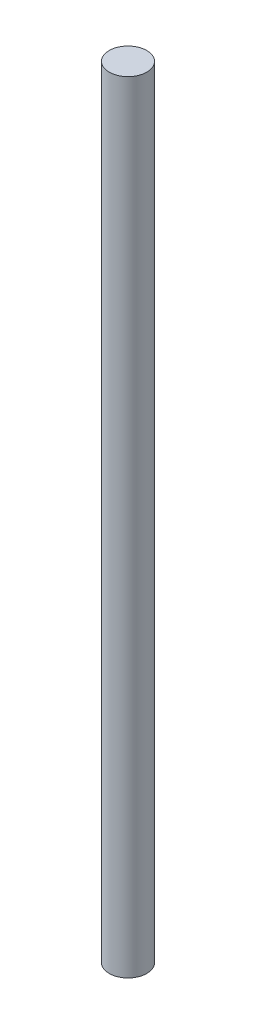
ISO-10303-21;
HEADER;
FILE_DESCRIPTION(('STEP AP214'),'2;1');
FILE_NAME('part.step','',(''),(''),'','','');
FILE_SCHEMA(('AUTOMOTIVE_DESIGN { 1 0 10303 214 1 1 1 1 }'));
ENDSEC;
DATA;
#1=APPLICATION_CONTEXT('core data for automotive mechanical design processes');
#2=APPLICATION_PROTOCOL_DEFINITION('international standard','automotive_design',2000,#1);
#3=PRODUCT_CONTEXT('',#1,'mechanical');
#4=PRODUCT('Part','Part','',(#3));
#5=PRODUCT_RELATED_PRODUCT_CATEGORY('part','',(#4));
#6=PRODUCT_DEFINITION_FORMATION('','',#4);
#7=PRODUCT_DEFINITION_CONTEXT('part definition',#1,'design');
#8=PRODUCT_DEFINITION('design','',#6,#7);
#9=PRODUCT_DEFINITION_SHAPE('','',#8);
#10=(LENGTH_UNIT() NAMED_UNIT(*) SI_UNIT(.MILLI.,.METRE.));
#11=(NAMED_UNIT(*) PLANE_ANGLE_UNIT() SI_UNIT($,.RADIAN.));
#12=(NAMED_UNIT(*) SI_UNIT($,.STERADIAN.) SOLID_ANGLE_UNIT());
#13=UNCERTAINTY_MEASURE_WITH_UNIT(LENGTH_MEASURE(1.E-05),#10,'distance_accuracy_value','');
#14=(GEOMETRIC_REPRESENTATION_CONTEXT(3) GLOBAL_UNCERTAINTY_ASSIGNED_CONTEXT((#13)) GLOBAL_UNIT_ASSIGNED_CONTEXT((#10,
#11,#12)) REPRESENTATION_CONTEXT('',''));
#15=CARTESIAN_POINT('',(0.,0.,0.));
#16=DIRECTION('',(0.,0.,1.));
#17=DIRECTION('',(1.,0.,0.));
#18=AXIS2_PLACEMENT_3D('',#15,#16,#17);
#19=CARTESIAN_POINT('',(0.,79.,0.));
#20=DIRECTION('',(0.,-1.,0.));
#21=DIRECTION('',(0.,0.,-1.));
#22=AXIS2_PLACEMENT_3D('',#19,#20,#21);
#23=CYLINDRICAL_SURFACE('',#22,1.9);
#24=CARTESIAN_POINT('',(0.,79.,0.));
#25=DIRECTION('',(0.,1.,0.));
#26=DIRECTION('',(0.,0.,1.));
#27=AXIS2_PLACEMENT_3D('',#24,#25,#26);
#28=CIRCLE('',#27,1.9);
#29=CARTESIAN_POINT('',(0.,79.,1.9));
#30=VERTEX_POINT('',#29);
#31=EDGE_CURVE('E10',#30,#30,#28,.T.);
#32=ORIENTED_EDGE('',*,*,#31,.F.);
#33=EDGE_LOOP('',(#32));
#34=FACE_BOUND('',#33,.T.);
#35=CARTESIAN_POINT('',(0.,0.,0.));
#36=DIRECTION('',(0.,1.,0.));
#37=DIRECTION('',(0.,0.,1.));
#38=AXIS2_PLACEMENT_3D('',#35,#36,#37);
#39=CIRCLE('',#38,1.9);
#40=CARTESIAN_POINT('',(0.,0.,1.9));
#41=VERTEX_POINT('',#40);
#42=EDGE_CURVE('E34',#41,#41,#39,.T.);
#43=ORIENTED_EDGE('',*,*,#42,.T.);
#44=EDGE_LOOP('',(#43));
#45=FACE_BOUND('',#44,.T.);
#46=ADVANCED_FACE('F31',(#34,#45),#23,.T.);
#47=CARTESIAN_POINT('',(0.,79.,0.));
#48=DIRECTION('',(0.,1.,0.));
#49=DIRECTION('',(0.,0.,1.));
#50=AXIS2_PLACEMENT_3D('',#47,#48,#49);
#51=PLANE('',#50);
#52=ORIENTED_EDGE('',*,*,#31,.T.);
#53=EDGE_LOOP('',(#52));
#54=FACE_BOUND('',#53,.T.);
#55=ADVANCED_FACE('F46',(#54),#51,.T.);
#56=CARTESIAN_POINT('',(0.,0.,0.));
#57=DIRECTION('',(0.,1.,0.));
#58=DIRECTION('',(0.,0.,1.));
#59=AXIS2_PLACEMENT_3D('',#56,#57,#58);
#60=PLANE('',#59);
#61=ORIENTED_EDGE('',*,*,#42,.F.);
#62=EDGE_LOOP('',(#61));
#63=FACE_BOUND('',#62,.T.);
#64=ADVANCED_FACE('F44',(#63),#60,.F.);
#65=CLOSED_SHELL('',(#46,#55,#64));
#66=MANIFOLD_SOLID_BREP('B2',#65);
#67=ADVANCED_BREP_SHAPE_REPRESENTATION('',(#18,#66),#14);
#68=SHAPE_DEFINITION_REPRESENTATION(#9,#67);
ENDSEC;
END-ISO-10303-21;
